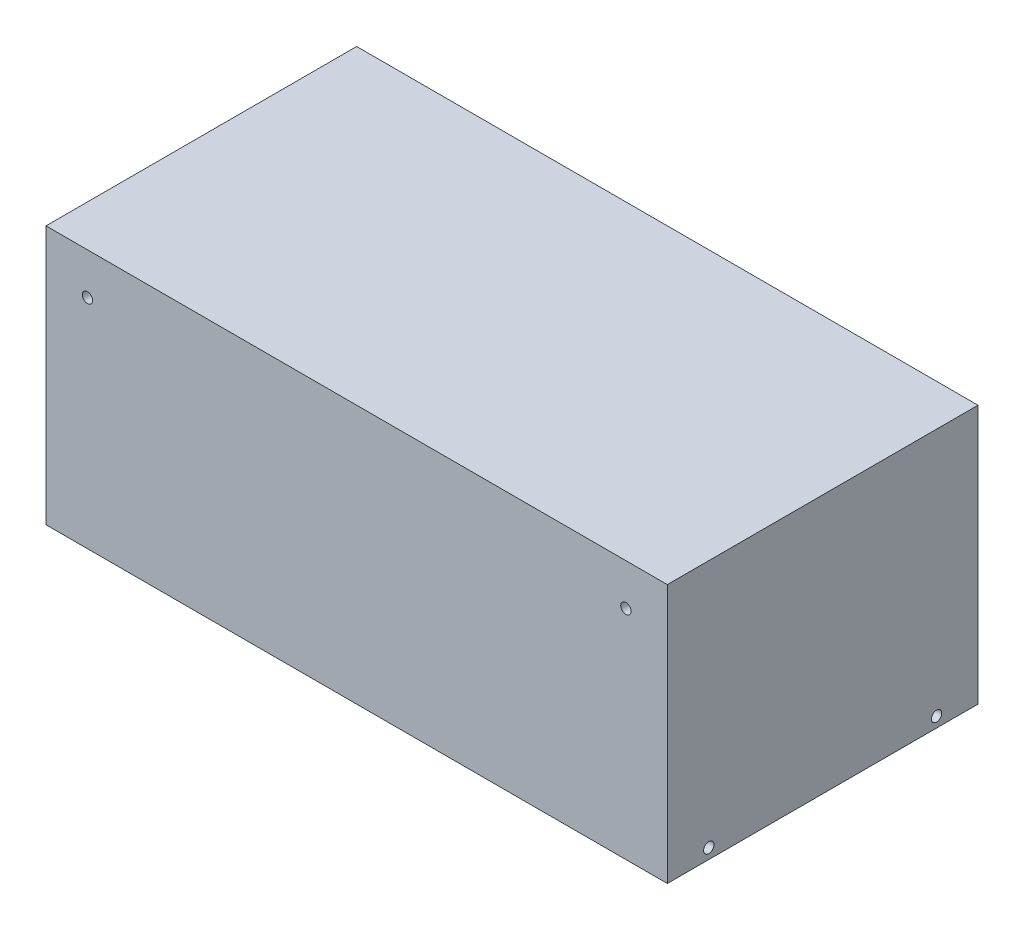
ISO-10303-21;
HEADER;
FILE_DESCRIPTION(('STEP AP214'),'2;1');
FILE_NAME('part.step','',(''),(''),'','','');
FILE_SCHEMA(('AUTOMOTIVE_DESIGN { 1 0 10303 214 1 1 1 1 }'));
ENDSEC;
DATA;
#1=APPLICATION_CONTEXT('core data for automotive mechanical design processes');
#2=APPLICATION_PROTOCOL_DEFINITION('international standard','automotive_design',2000,#1);
#3=PRODUCT_CONTEXT('',#1,'mechanical');
#4=PRODUCT('Part','Part','',(#3));
#5=PRODUCT_RELATED_PRODUCT_CATEGORY('part','',(#4));
#6=PRODUCT_DEFINITION_FORMATION('','',#4);
#7=PRODUCT_DEFINITION_CONTEXT('part definition',#1,'design');
#8=PRODUCT_DEFINITION('design','',#6,#7);
#9=PRODUCT_DEFINITION_SHAPE('','',#8);
#10=(LENGTH_UNIT() NAMED_UNIT(*) SI_UNIT(.MILLI.,.METRE.));
#11=(NAMED_UNIT(*) PLANE_ANGLE_UNIT() SI_UNIT($,.RADIAN.));
#12=(NAMED_UNIT(*) SI_UNIT($,.STERADIAN.) SOLID_ANGLE_UNIT());
#13=UNCERTAINTY_MEASURE_WITH_UNIT(LENGTH_MEASURE(1.E-05),#10,'distance_accuracy_value','');
#14=(GEOMETRIC_REPRESENTATION_CONTEXT(3) GLOBAL_UNCERTAINTY_ASSIGNED_CONTEXT((#13)) GLOBAL_UNIT_ASSIGNED_CONTEXT((#10,
#11,#12)) REPRESENTATION_CONTEXT('',''));
#15=CARTESIAN_POINT('',(0.,0.,0.));
#16=DIRECTION('',(0.,0.,1.));
#17=DIRECTION('',(1.,0.,0.));
#18=AXIS2_PLACEMENT_3D('',#15,#16,#17);
#19=CARTESIAN_POINT('',(-150.,125.,75.));
#20=DIRECTION('',(1.,0.,0.));
#21=DIRECTION('',(0.,0.,-1.));
#22=AXIS2_PLACEMENT_3D('',#19,#20,#21);
#23=PLANE('',#22);
#24=CARTESIAN_POINT('',(-150.,5.,-55.));
#25=DIRECTION('',(1.,0.,0.));
#26=DIRECTION('',(0.,0.,-1.));
#27=AXIS2_PLACEMENT_3D('',#24,#25,#26);
#28=CIRCLE('',#27,2.5);
#29=CARTESIAN_POINT('',(-150.,5.,-57.5));
#30=VERTEX_POINT('',#29);
#31=EDGE_CURVE('E202',#30,#30,#28,.T.);
#32=ORIENTED_EDGE('',*,*,#31,.T.);
#33=EDGE_LOOP('',(#32));
#34=FACE_BOUND('',#33,.T.);
#35=CARTESIAN_POINT('',(-150.,5.,55.));
#36=DIRECTION('',(1.,0.,0.));
#37=DIRECTION('',(0.,0.,-1.));
#38=AXIS2_PLACEMENT_3D('',#35,#36,#37);
#39=CIRCLE('',#38,2.5);
#40=CARTESIAN_POINT('',(-150.,5.,52.5));
#41=VERTEX_POINT('',#40);
#42=EDGE_CURVE('E133',#41,#41,#39,.T.);
#43=ORIENTED_EDGE('',*,*,#42,.T.);
#44=EDGE_LOOP('',(#43));
#45=FACE_BOUND('',#44,.T.);
#46=DIRECTION('',(0.,0.,1.));
#47=VECTOR('',#46,1.);
#48=CARTESIAN_POINT('',(-150.,0.,75.));
#49=LINE('',#48,#47);
#50=CARTESIAN_POINT('',(-150.,0.,-75.));
#51=VERTEX_POINT('',#50);
#52=CARTESIAN_POINT('',(-150.,0.,75.));
#53=VERTEX_POINT('',#52);
#54=EDGE_CURVE('E145',#51,#53,#49,.T.);
#55=ORIENTED_EDGE('',*,*,#54,.T.);
#56=DIRECTION('',(0.,-1.,0.));
#57=VECTOR('',#56,1.);
#58=CARTESIAN_POINT('',(-150.,125.,75.));
#59=LINE('',#58,#57);
#60=CARTESIAN_POINT('',(-150.,125.,75.));
#61=VERTEX_POINT('',#60);
#62=EDGE_CURVE('E11',#61,#53,#59,.T.);
#63=ORIENTED_EDGE('',*,*,#62,.F.);
#64=DIRECTION('',(0.,0.,1.));
#65=VECTOR('',#64,1.);
#66=CARTESIAN_POINT('',(-150.,125.,75.));
#67=LINE('',#66,#65);
#68=CARTESIAN_POINT('',(-150.,125.,-75.));
#69=VERTEX_POINT('',#68);
#70=EDGE_CURVE('E149',#69,#61,#67,.T.);
#71=ORIENTED_EDGE('',*,*,#70,.F.);
#72=DIRECTION('',(0.,-1.,0.));
#73=VECTOR('',#72,1.);
#74=CARTESIAN_POINT('',(-150.,125.,-75.));
#75=LINE('',#74,#73);
#76=EDGE_CURVE('E155',#69,#51,#75,.T.);
#77=ORIENTED_EDGE('',*,*,#76,.T.);
#78=EDGE_LOOP('',(#55,#63,#71,#77));
#79=FACE_BOUND('',#78,.T.);
#80=ADVANCED_FACE('F32',(#34,#45,#79),#23,.F.);
#81=CARTESIAN_POINT('',(150.,125.,75.));
#82=DIRECTION('',(0.,0.,-1.));
#83=DIRECTION('',(-1.,0.,0.));
#84=AXIS2_PLACEMENT_3D('',#81,#82,#83);
#85=PLANE('',#84);
#86=CARTESIAN_POINT('',(130.,105.,75.));
#87=DIRECTION('',(0.,0.,1.));
#88=DIRECTION('',(-1.,0.,0.));
#89=AXIS2_PLACEMENT_3D('',#86,#87,#88);
#90=CIRCLE('',#89,2.5);
#91=CARTESIAN_POINT('',(127.5,105.,75.));
#92=VERTEX_POINT('',#91);
#93=EDGE_CURVE('E419',#92,#92,#90,.T.);
#94=ORIENTED_EDGE('',*,*,#93,.F.);
#95=EDGE_LOOP('',(#94));
#96=FACE_BOUND('',#95,.T.);
#97=CARTESIAN_POINT('',(-130.,105.,75.));
#98=DIRECTION('',(0.,0.,1.));
#99=DIRECTION('',(1.,0.,0.));
#100=AXIS2_PLACEMENT_3D('',#97,#98,#99);
#101=CIRCLE('',#100,2.5);
#102=CARTESIAN_POINT('',(-127.5,105.,75.));
#103=VERTEX_POINT('',#102);
#104=EDGE_CURVE('E180',#103,#103,#101,.T.);
#105=ORIENTED_EDGE('',*,*,#104,.F.);
#106=EDGE_LOOP('',(#105));
#107=FACE_BOUND('',#106,.T.);
#108=DIRECTION('',(1.,0.,0.));
#109=VECTOR('',#108,1.);
#110=CARTESIAN_POINT('',(150.,0.,75.));
#111=LINE('',#110,#109);
#112=CARTESIAN_POINT('',(150.,0.,75.));
#113=VERTEX_POINT('',#112);
#114=EDGE_CURVE('E158',#53,#113,#111,.T.);
#115=ORIENTED_EDGE('',*,*,#114,.T.);
#116=DIRECTION('',(0.,-1.,0.));
#117=VECTOR('',#116,1.);
#118=CARTESIAN_POINT('',(150.,125.,75.));
#119=LINE('',#118,#117);
#120=CARTESIAN_POINT('',(150.,125.,75.));
#121=VERTEX_POINT('',#120);
#122=EDGE_CURVE('E40',#121,#113,#119,.T.);
#123=ORIENTED_EDGE('',*,*,#122,.F.);
#124=DIRECTION('',(1.,0.,0.));
#125=VECTOR('',#124,1.);
#126=CARTESIAN_POINT('',(150.,125.,75.));
#127=LINE('',#126,#125);
#128=EDGE_CURVE('E85',#61,#121,#127,.T.);
#129=ORIENTED_EDGE('',*,*,#128,.F.);
#130=ORIENTED_EDGE('',*,*,#62,.T.);
#131=EDGE_LOOP('',(#115,#123,#129,#130));
#132=FACE_BOUND('',#131,.T.);
#133=ADVANCED_FACE('F230',(#96,#107,#132),#85,.F.);
#134=CARTESIAN_POINT('',(150.,125.,75.));
#135=DIRECTION('',(-1.,0.,0.));
#136=DIRECTION('',(0.,0.,1.));
#137=AXIS2_PLACEMENT_3D('',#134,#135,#136);
#138=PLANE('',#137);
#139=CARTESIAN_POINT('',(150.,5.,-55.));
#140=DIRECTION('',(1.,0.,0.));
#141=DIRECTION('',(0.,0.,-1.));
#142=AXIS2_PLACEMENT_3D('',#139,#140,#141);
#143=CIRCLE('',#142,2.5);
#144=CARTESIAN_POINT('',(150.,5.,-57.5));
#145=VERTEX_POINT('',#144);
#146=EDGE_CURVE('E176',#145,#145,#143,.T.);
#147=ORIENTED_EDGE('',*,*,#146,.F.);
#148=EDGE_LOOP('',(#147));
#149=FACE_BOUND('',#148,.T.);
#150=CARTESIAN_POINT('',(150.,5.,55.));
#151=DIRECTION('',(1.,0.,0.));
#152=DIRECTION('',(0.,0.,-1.));
#153=AXIS2_PLACEMENT_3D('',#150,#151,#152);
#154=CIRCLE('',#153,2.5);
#155=CARTESIAN_POINT('',(150.,5.,52.5));
#156=VERTEX_POINT('',#155);
#157=EDGE_CURVE('E172',#156,#156,#154,.T.);
#158=ORIENTED_EDGE('',*,*,#157,.F.);
#159=EDGE_LOOP('',(#158));
#160=FACE_BOUND('',#159,.T.);
#161=DIRECTION('',(0.,0.,-1.));
#162=VECTOR('',#161,1.);
#163=CARTESIAN_POINT('',(150.,0.,75.));
#164=LINE('',#163,#162);
#165=CARTESIAN_POINT('',(150.,0.,-75.));
#166=VERTEX_POINT('',#165);
#167=EDGE_CURVE('E160',#113,#166,#164,.T.);
#168=ORIENTED_EDGE('',*,*,#167,.T.);
#169=DIRECTION('',(0.,-1.,0.));
#170=VECTOR('',#169,1.);
#171=CARTESIAN_POINT('',(150.,125.,-75.));
#172=LINE('',#171,#170);
#173=CARTESIAN_POINT('',(150.,125.,-75.));
#174=VERTEX_POINT('',#173);
#175=EDGE_CURVE('E164',#174,#166,#172,.T.);
#176=ORIENTED_EDGE('',*,*,#175,.F.);
#177=DIRECTION('',(0.,0.,-1.));
#178=VECTOR('',#177,1.);
#179=CARTESIAN_POINT('',(150.,125.,75.));
#180=LINE('',#179,#178);
#181=EDGE_CURVE('E152',#121,#174,#180,.T.);
#182=ORIENTED_EDGE('',*,*,#181,.F.);
#183=ORIENTED_EDGE('',*,*,#122,.T.);
#184=EDGE_LOOP('',(#168,#176,#182,#183));
#185=FACE_BOUND('',#184,.T.);
#186=ADVANCED_FACE('F235',(#149,#160,#185),#138,.F.);
#187=CARTESIAN_POINT('',(150.,125.,-75.));
#188=DIRECTION('',(0.,0.,1.));
#189=DIRECTION('',(1.,0.,0.));
#190=AXIS2_PLACEMENT_3D('',#187,#188,#189);
#191=PLANE('',#190);
#192=CARTESIAN_POINT('',(130.,105.,-75.));
#193=DIRECTION('',(0.,0.,1.));
#194=DIRECTION('',(1.,0.,0.));
#195=AXIS2_PLACEMENT_3D('',#192,#193,#194);
#196=CIRCLE('',#195,2.5);
#197=CARTESIAN_POINT('',(132.5,105.,-75.));
#198=VERTEX_POINT('',#197);
#199=EDGE_CURVE('E187',#198,#198,#196,.T.);
#200=ORIENTED_EDGE('',*,*,#199,.T.);
#201=EDGE_LOOP('',(#200));
#202=FACE_BOUND('',#201,.T.);
#203=CARTESIAN_POINT('',(-130.,105.,-75.));
#204=DIRECTION('',(0.,0.,1.));
#205=DIRECTION('',(1.,0.,0.));
#206=AXIS2_PLACEMENT_3D('',#203,#204,#205);
#207=CIRCLE('',#206,2.5);
#208=CARTESIAN_POINT('',(-127.5,105.,-75.));
#209=VERTEX_POINT('',#208);
#210=EDGE_CURVE('E184',#209,#209,#207,.T.);
#211=ORIENTED_EDGE('',*,*,#210,.T.);
#212=EDGE_LOOP('',(#211));
#213=FACE_BOUND('',#212,.T.);
#214=DIRECTION('',(-1.,0.,0.));
#215=VECTOR('',#214,1.);
#216=CARTESIAN_POINT('',(150.,0.,-75.));
#217=LINE('',#216,#215);
#218=EDGE_CURVE('E78',#166,#51,#217,.T.);
#219=ORIENTED_EDGE('',*,*,#218,.T.);
#220=ORIENTED_EDGE('',*,*,#76,.F.);
#221=DIRECTION('',(-1.,0.,0.));
#222=VECTOR('',#221,1.);
#223=CARTESIAN_POINT('',(150.,125.,-75.));
#224=LINE('',#223,#222);
#225=EDGE_CURVE('E57',#174,#69,#224,.T.);
#226=ORIENTED_EDGE('',*,*,#225,.F.);
#227=ORIENTED_EDGE('',*,*,#175,.T.);
#228=EDGE_LOOP('',(#219,#220,#226,#227));
#229=FACE_BOUND('',#228,.T.);
#230=ADVANCED_FACE('F264',(#202,#213,#229),#191,.F.);
#231=CARTESIAN_POINT('',(0.,125.,0.));
#232=DIRECTION('',(0.,1.,0.));
#233=DIRECTION('',(0.,0.,1.));
#234=AXIS2_PLACEMENT_3D('',#231,#232,#233);
#235=PLANE('',#234);
#236=ORIENTED_EDGE('',*,*,#70,.T.);
#237=ORIENTED_EDGE('',*,*,#128,.T.);
#238=ORIENTED_EDGE('',*,*,#181,.T.);
#239=ORIENTED_EDGE('',*,*,#225,.T.);
#240=EDGE_LOOP('',(#236,#237,#238,#239));
#241=FACE_BOUND('',#240,.T.);
#242=ADVANCED_FACE('F267',(#241),#235,.T.);
#243=CARTESIAN_POINT('',(0.,0.,0.));
#244=DIRECTION('',(0.,1.,0.));
#245=DIRECTION('',(0.,0.,1.));
#246=AXIS2_PLACEMENT_3D('',#243,#244,#245);
#247=PLANE('',#246);
#248=DIRECTION('',(1.,0.,0.));
#249=VECTOR('',#248,1.);
#250=CARTESIAN_POINT('',(135.,0.,-60.));
#251=LINE('',#250,#249);
#252=CARTESIAN_POINT('',(-135.,0.,-60.));
#253=VERTEX_POINT('',#252);
#254=CARTESIAN_POINT('',(135.,0.,-60.));
#255=VERTEX_POINT('',#254);
#256=EDGE_CURVE('E139',#253,#255,#251,.T.);
#257=ORIENTED_EDGE('',*,*,#256,.F.);
#258=DIRECTION('',(0.,0.,-1.));
#259=VECTOR('',#258,1.);
#260=CARTESIAN_POINT('',(-135.,0.,-60.));
#261=LINE('',#260,#259);
#262=CARTESIAN_POINT('',(-135.,0.,60.));
#263=VERTEX_POINT('',#262);
#264=EDGE_CURVE('E48',#263,#253,#261,.T.);
#265=ORIENTED_EDGE('',*,*,#264,.F.);
#266=DIRECTION('',(-1.,0.,0.));
#267=VECTOR('',#266,1.);
#268=CARTESIAN_POINT('',(135.,0.,60.));
#269=LINE('',#268,#267);
#270=CARTESIAN_POINT('',(135.,0.,60.));
#271=VERTEX_POINT('',#270);
#272=EDGE_CURVE('E127',#271,#263,#269,.T.);
#273=ORIENTED_EDGE('',*,*,#272,.F.);
#274=DIRECTION('',(0.,0.,1.));
#275=VECTOR('',#274,1.);
#276=CARTESIAN_POINT('',(135.,0.,-60.));
#277=LINE('',#276,#275);
#278=EDGE_CURVE('E130',#255,#271,#277,.T.);
#279=ORIENTED_EDGE('',*,*,#278,.F.);
#280=EDGE_LOOP('',(#257,#265,#273,#279));
#281=FACE_BOUND('',#280,.T.);
#282=ORIENTED_EDGE('',*,*,#54,.F.);
#283=ORIENTED_EDGE('',*,*,#218,.F.);
#284=ORIENTED_EDGE('',*,*,#167,.F.);
#285=ORIENTED_EDGE('',*,*,#114,.F.);
#286=EDGE_LOOP('',(#282,#283,#284,#285));
#287=FACE_BOUND('',#286,.T.);
#288=ADVANCED_FACE('F275',(#281,#287),#247,.F.);
#289=CARTESIAN_POINT('',(-135.,110.,-60.));
#290=DIRECTION('',(-1.,0.,0.));
#291=DIRECTION('',(0.,0.,1.));
#292=AXIS2_PLACEMENT_3D('',#289,#290,#291);
#293=PLANE('',#292);
#294=CARTESIAN_POINT('',(-135.,5.,-55.));
#295=DIRECTION('',(-1.,0.,0.));
#296=DIRECTION('',(0.,0.,1.));
#297=AXIS2_PLACEMENT_3D('',#294,#295,#296);
#298=CIRCLE('',#297,2.5);
#299=CARTESIAN_POINT('',(-135.,5.,-52.5));
#300=VERTEX_POINT('',#299);
#301=EDGE_CURVE('E175',#300,#300,#298,.T.);
#302=ORIENTED_EDGE('',*,*,#301,.T.);
#303=EDGE_LOOP('',(#302));
#304=FACE_BOUND('',#303,.T.);
#305=CARTESIAN_POINT('',(-135.,5.,55.));
#306=DIRECTION('',(-1.,0.,0.));
#307=DIRECTION('',(0.,0.,1.));
#308=AXIS2_PLACEMENT_3D('',#305,#306,#307);
#309=CIRCLE('',#308,2.5);
#310=CARTESIAN_POINT('',(-135.,5.,57.5));
#311=VERTEX_POINT('',#310);
#312=EDGE_CURVE('E171',#311,#311,#309,.T.);
#313=ORIENTED_EDGE('',*,*,#312,.T.);
#314=EDGE_LOOP('',(#313));
#315=FACE_BOUND('',#314,.T.);
#316=ORIENTED_EDGE('',*,*,#264,.T.);
#317=DIRECTION('',(0.,-1.,0.));
#318=VECTOR('',#317,1.);
#319=CARTESIAN_POINT('',(-135.,110.,-60.));
#320=LINE('',#319,#318);
#321=CARTESIAN_POINT('',(-135.,110.,-60.));
#322=VERTEX_POINT('',#321);
#323=EDGE_CURVE('E105',#322,#253,#320,.T.);
#324=ORIENTED_EDGE('',*,*,#323,.F.);
#325=DIRECTION('',(0.,0.,-1.));
#326=VECTOR('',#325,1.);
#327=CARTESIAN_POINT('',(-135.,110.,-60.));
#328=LINE('',#327,#326);
#329=CARTESIAN_POINT('',(-135.,110.,60.));
#330=VERTEX_POINT('',#329);
#331=EDGE_CURVE('E109',#330,#322,#328,.T.);
#332=ORIENTED_EDGE('',*,*,#331,.F.);
#333=DIRECTION('',(0.,-1.,0.));
#334=VECTOR('',#333,1.);
#335=CARTESIAN_POINT('',(-135.,110.,60.));
#336=LINE('',#335,#334);
#337=EDGE_CURVE('E143',#330,#263,#336,.T.);
#338=ORIENTED_EDGE('',*,*,#337,.T.);
#339=EDGE_LOOP('',(#316,#324,#332,#338));
#340=FACE_BOUND('',#339,.T.);
#341=ADVANCED_FACE('F107',(#304,#315,#340),#293,.F.);
#342=CARTESIAN_POINT('',(135.,110.,60.));
#343=DIRECTION('',(0.,0.,1.));
#344=DIRECTION('',(1.,0.,0.));
#345=AXIS2_PLACEMENT_3D('',#342,#343,#344);
#346=PLANE('',#345);
#347=CARTESIAN_POINT('',(130.,105.,60.0000000000001));
#348=DIRECTION('',(0.,0.,1.));
#349=DIRECTION('',(1.,0.,0.));
#350=AXIS2_PLACEMENT_3D('',#347,#348,#349);
#351=CIRCLE('',#350,2.5);
#352=CARTESIAN_POINT('',(132.5,105.,60.0000000000001));
#353=VERTEX_POINT('',#352);
#354=EDGE_CURVE('E192',#353,#353,#351,.T.);
#355=ORIENTED_EDGE('',*,*,#354,.T.);
#356=EDGE_LOOP('',(#355));
#357=FACE_BOUND('',#356,.T.);
#358=CARTESIAN_POINT('',(-130.,105.,60.0000000000001));
#359=DIRECTION('',(0.,0.,1.));
#360=DIRECTION('',(1.,0.,0.));
#361=AXIS2_PLACEMENT_3D('',#358,#359,#360);
#362=CIRCLE('',#361,2.5);
#363=CARTESIAN_POINT('',(-127.5,105.,60.0000000000001));
#364=VERTEX_POINT('',#363);
#365=EDGE_CURVE('E179',#364,#364,#362,.T.);
#366=ORIENTED_EDGE('',*,*,#365,.T.);
#367=EDGE_LOOP('',(#366));
#368=FACE_BOUND('',#367,.T.);
#369=ORIENTED_EDGE('',*,*,#272,.T.);
#370=ORIENTED_EDGE('',*,*,#337,.F.);
#371=DIRECTION('',(-1.,0.,0.));
#372=VECTOR('',#371,1.);
#373=CARTESIAN_POINT('',(135.,110.,60.));
#374=LINE('',#373,#372);
#375=CARTESIAN_POINT('',(135.,110.,60.));
#376=VERTEX_POINT('',#375);
#377=EDGE_CURVE('E115',#376,#330,#374,.T.);
#378=ORIENTED_EDGE('',*,*,#377,.F.);
#379=DIRECTION('',(0.,-1.,0.));
#380=VECTOR('',#379,1.);
#381=CARTESIAN_POINT('',(135.,110.,60.));
#382=LINE('',#381,#380);
#383=EDGE_CURVE('E146',#376,#271,#382,.T.);
#384=ORIENTED_EDGE('',*,*,#383,.T.);
#385=EDGE_LOOP('',(#369,#370,#378,#384));
#386=FACE_BOUND('',#385,.T.);
#387=ADVANCED_FACE('F285',(#357,#368,#386),#346,.F.);
#388=CARTESIAN_POINT('',(135.,110.,-60.));
#389=DIRECTION('',(1.,0.,0.));
#390=DIRECTION('',(0.,0.,-1.));
#391=AXIS2_PLACEMENT_3D('',#388,#389,#390);
#392=PLANE('',#391);
#393=CARTESIAN_POINT('',(135.,5.,-55.));
#394=DIRECTION('',(1.,0.,0.));
#395=DIRECTION('',(0.,0.,-1.));
#396=AXIS2_PLACEMENT_3D('',#393,#394,#395);
#397=CIRCLE('',#396,2.5);
#398=CARTESIAN_POINT('',(135.,5.,-57.5));
#399=VERTEX_POINT('',#398);
#400=EDGE_CURVE('E173',#399,#399,#397,.T.);
#401=ORIENTED_EDGE('',*,*,#400,.T.);
#402=EDGE_LOOP('',(#401));
#403=FACE_BOUND('',#402,.T.);
#404=CARTESIAN_POINT('',(135.,5.,55.));
#405=DIRECTION('',(1.,0.,0.));
#406=DIRECTION('',(0.,0.,-1.));
#407=AXIS2_PLACEMENT_3D('',#404,#405,#406);
#408=CIRCLE('',#407,2.5);
#409=CARTESIAN_POINT('',(135.,5.,52.5));
#410=VERTEX_POINT('',#409);
#411=EDGE_CURVE('E168',#410,#410,#408,.T.);
#412=ORIENTED_EDGE('',*,*,#411,.T.);
#413=EDGE_LOOP('',(#412));
#414=FACE_BOUND('',#413,.T.);
#415=ORIENTED_EDGE('',*,*,#278,.T.);
#416=ORIENTED_EDGE('',*,*,#383,.F.);
#417=DIRECTION('',(0.,0.,1.));
#418=VECTOR('',#417,1.);
#419=CARTESIAN_POINT('',(135.,110.,-60.));
#420=LINE('',#419,#418);
#421=CARTESIAN_POINT('',(135.,110.,-60.));
#422=VERTEX_POINT('',#421);
#423=EDGE_CURVE('E123',#422,#376,#420,.T.);
#424=ORIENTED_EDGE('',*,*,#423,.F.);
#425=DIRECTION('',(0.,-1.,0.));
#426=VECTOR('',#425,1.);
#427=CARTESIAN_POINT('',(135.,110.,-60.));
#428=LINE('',#427,#426);
#429=EDGE_CURVE('E114',#422,#255,#428,.T.);
#430=ORIENTED_EDGE('',*,*,#429,.T.);
#431=EDGE_LOOP('',(#415,#416,#424,#430));
#432=FACE_BOUND('',#431,.T.);
#433=ADVANCED_FACE('F289',(#403,#414,#432),#392,.F.);
#434=CARTESIAN_POINT('',(135.,110.,-60.));
#435=DIRECTION('',(0.,0.,-1.));
#436=DIRECTION('',(-1.,0.,0.));
#437=AXIS2_PLACEMENT_3D('',#434,#435,#436);
#438=PLANE('',#437);
#439=CARTESIAN_POINT('',(130.,105.,-60.));
#440=DIRECTION('',(0.,0.,-1.));
#441=DIRECTION('',(-1.,0.,0.));
#442=AXIS2_PLACEMENT_3D('',#439,#440,#441);
#443=CIRCLE('',#442,2.5);
#444=CARTESIAN_POINT('',(127.5,105.,-60.));
#445=VERTEX_POINT('',#444);
#446=EDGE_CURVE('E35',#445,#445,#443,.T.);
#447=ORIENTED_EDGE('',*,*,#446,.T.);
#448=EDGE_LOOP('',(#447));
#449=FACE_BOUND('',#448,.T.);
#450=CARTESIAN_POINT('',(-130.,105.,-60.));
#451=DIRECTION('',(0.,0.,-1.));
#452=DIRECTION('',(-1.,0.,0.));
#453=AXIS2_PLACEMENT_3D('',#450,#451,#452);
#454=CIRCLE('',#453,2.5);
#455=CARTESIAN_POINT('',(-132.5,105.,-60.));
#456=VERTEX_POINT('',#455);
#457=EDGE_CURVE('E177',#456,#456,#454,.T.);
#458=ORIENTED_EDGE('',*,*,#457,.T.);
#459=EDGE_LOOP('',(#458));
#460=FACE_BOUND('',#459,.T.);
#461=ORIENTED_EDGE('',*,*,#256,.T.);
#462=ORIENTED_EDGE('',*,*,#429,.F.);
#463=DIRECTION('',(1.,0.,0.));
#464=VECTOR('',#463,1.);
#465=CARTESIAN_POINT('',(135.,110.,-60.));
#466=LINE('',#465,#464);
#467=EDGE_CURVE('E118',#322,#422,#466,.T.);
#468=ORIENTED_EDGE('',*,*,#467,.F.);
#469=ORIENTED_EDGE('',*,*,#323,.T.);
#470=EDGE_LOOP('',(#461,#462,#468,#469));
#471=FACE_BOUND('',#470,.T.);
#472=ADVANCED_FACE('F119',(#449,#460,#471),#438,.F.);
#473=CARTESIAN_POINT('',(0.,110.,0.));
#474=DIRECTION('',(0.,-1.,0.));
#475=DIRECTION('',(0.,0.,-1.));
#476=AXIS2_PLACEMENT_3D('',#473,#474,#475);
#477=PLANE('',#476);
#478=ORIENTED_EDGE('',*,*,#331,.T.);
#479=ORIENTED_EDGE('',*,*,#467,.T.);
#480=ORIENTED_EDGE('',*,*,#423,.T.);
#481=ORIENTED_EDGE('',*,*,#377,.T.);
#482=EDGE_LOOP('',(#478,#479,#480,#481));
#483=FACE_BOUND('',#482,.T.);
#484=ADVANCED_FACE('F125',(#483),#477,.T.);
#485=CARTESIAN_POINT('',(-200.,5.,55.));
#486=DIRECTION('',(1.,0.,0.));
#487=DIRECTION('',(0.,0.,-1.));
#488=AXIS2_PLACEMENT_3D('',#485,#486,#487);
#489=CYLINDRICAL_SURFACE('',#488,2.5);
#490=ORIENTED_EDGE('',*,*,#157,.T.);
#491=EDGE_LOOP('',(#490));
#492=FACE_BOUND('',#491,.T.);
#493=ORIENTED_EDGE('',*,*,#411,.F.);
#494=EDGE_LOOP('',(#493));
#495=FACE_BOUND('',#494,.T.);
#496=ADVANCED_FACE('F217',(#492,#495),#489,.F.);
#497=ORIENTED_EDGE('',*,*,#312,.F.);
#498=EDGE_LOOP('',(#497));
#499=FACE_BOUND('',#498,.T.);
#500=ORIENTED_EDGE('',*,*,#42,.F.);
#501=EDGE_LOOP('',(#500));
#502=FACE_BOUND('',#501,.T.);
#503=ADVANCED_FACE('F214',(#499,#502),#489,.F.);
#504=CARTESIAN_POINT('',(-200.,5.,-55.));
#505=DIRECTION('',(1.,0.,0.));
#506=DIRECTION('',(0.,0.,-1.));
#507=AXIS2_PLACEMENT_3D('',#504,#505,#506);
#508=CYLINDRICAL_SURFACE('',#507,2.5);
#509=ORIENTED_EDGE('',*,*,#146,.T.);
#510=EDGE_LOOP('',(#509));
#511=FACE_BOUND('',#510,.T.);
#512=ORIENTED_EDGE('',*,*,#400,.F.);
#513=EDGE_LOOP('',(#512));
#514=FACE_BOUND('',#513,.T.);
#515=ADVANCED_FACE('F216',(#511,#514),#508,.F.);
#516=ORIENTED_EDGE('',*,*,#301,.F.);
#517=EDGE_LOOP('',(#516));
#518=FACE_BOUND('',#517,.T.);
#519=ORIENTED_EDGE('',*,*,#31,.F.);
#520=EDGE_LOOP('',(#519));
#521=FACE_BOUND('',#520,.T.);
#522=ADVANCED_FACE('F224',(#518,#521),#508,.F.);
#523=CARTESIAN_POINT('',(-130.,105.,-100.));
#524=DIRECTION('',(0.,0.,1.));
#525=DIRECTION('',(1.,0.,0.));
#526=AXIS2_PLACEMENT_3D('',#523,#524,#525);
#527=CYLINDRICAL_SURFACE('',#526,2.5);
#528=ORIENTED_EDGE('',*,*,#457,.F.);
#529=EDGE_LOOP('',(#528));
#530=FACE_BOUND('',#529,.T.);
#531=ORIENTED_EDGE('',*,*,#210,.F.);
#532=EDGE_LOOP('',(#531));
#533=FACE_BOUND('',#532,.T.);
#534=ADVANCED_FACE('F240',(#530,#533),#527,.F.);
#535=ORIENTED_EDGE('',*,*,#104,.T.);
#536=EDGE_LOOP('',(#535));
#537=FACE_BOUND('',#536,.T.);
#538=ORIENTED_EDGE('',*,*,#365,.F.);
#539=EDGE_LOOP('',(#538));
#540=FACE_BOUND('',#539,.T.);
#541=ADVANCED_FACE('F245',(#537,#540),#527,.F.);
#542=CARTESIAN_POINT('',(130.,105.,-100.));
#543=DIRECTION('',(0.,0.,1.));
#544=DIRECTION('',(1.,0.,0.));
#545=AXIS2_PLACEMENT_3D('',#542,#543,#544);
#546=CYLINDRICAL_SURFACE('',#545,2.5);
#547=ORIENTED_EDGE('',*,*,#446,.F.);
#548=EDGE_LOOP('',(#547));
#549=FACE_BOUND('',#548,.T.);
#550=ORIENTED_EDGE('',*,*,#199,.F.);
#551=EDGE_LOOP('',(#550));
#552=FACE_BOUND('',#551,.T.);
#553=ADVANCED_FACE('F250',(#549,#552),#546,.F.);
#554=ORIENTED_EDGE('',*,*,#93,.T.);
#555=EDGE_LOOP('',(#554));
#556=FACE_BOUND('',#555,.T.);
#557=ORIENTED_EDGE('',*,*,#354,.F.);
#558=EDGE_LOOP('',(#557));
#559=FACE_BOUND('',#558,.T.);
#560=ADVANCED_FACE('F252',(#556,#559),#546,.F.);
#561=CLOSED_SHELL('',(#80,#133,#186,#230,#242,#288,#341,#387,#433,#472,#484,#496,#503,#515,#522,
#534,#541,#553,#560));
#562=MANIFOLD_SOLID_BREP('B2',#561);
#563=ADVANCED_BREP_SHAPE_REPRESENTATION('',(#18,#562),#14);
#564=SHAPE_DEFINITION_REPRESENTATION(#9,#563);
ENDSEC;
END-ISO-10303-21;
